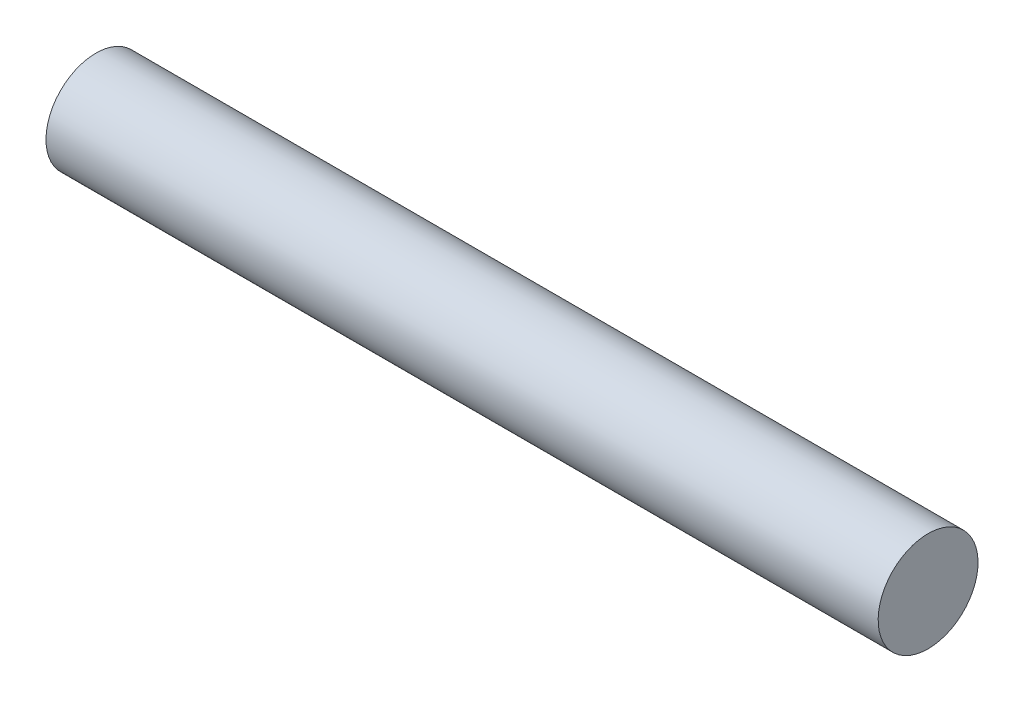
ISO-10303-21;
HEADER;
FILE_DESCRIPTION(('STEP AP214'),'2;1');
FILE_NAME('part.step','',(''),(''),'','','');
FILE_SCHEMA(('AUTOMOTIVE_DESIGN { 1 0 10303 214 1 1 1 1 }'));
ENDSEC;
DATA;
#1=APPLICATION_CONTEXT('core data for automotive mechanical design processes');
#2=APPLICATION_PROTOCOL_DEFINITION('international standard','automotive_design',2000,#1);
#3=PRODUCT_CONTEXT('',#1,'mechanical');
#4=PRODUCT('Part','Part','',(#3));
#5=PRODUCT_RELATED_PRODUCT_CATEGORY('part','',(#4));
#6=PRODUCT_DEFINITION_FORMATION('','',#4);
#7=PRODUCT_DEFINITION_CONTEXT('part definition',#1,'design');
#8=PRODUCT_DEFINITION('design','',#6,#7);
#9=PRODUCT_DEFINITION_SHAPE('','',#8);
#10=(LENGTH_UNIT() NAMED_UNIT(*) SI_UNIT(.MILLI.,.METRE.));
#11=(NAMED_UNIT(*) PLANE_ANGLE_UNIT() SI_UNIT($,.RADIAN.));
#12=(NAMED_UNIT(*) SI_UNIT($,.STERADIAN.) SOLID_ANGLE_UNIT());
#13=UNCERTAINTY_MEASURE_WITH_UNIT(LENGTH_MEASURE(1.E-05),#10,'distance_accuracy_value','');
#14=(GEOMETRIC_REPRESENTATION_CONTEXT(3) GLOBAL_UNCERTAINTY_ASSIGNED_CONTEXT((#13)) GLOBAL_UNIT_ASSIGNED_CONTEXT((#10,
#11,#12)) REPRESENTATION_CONTEXT('',''));
#15=CARTESIAN_POINT('',(0.,0.,0.));
#16=DIRECTION('',(0.,0.,1.));
#17=DIRECTION('',(1.,0.,0.));
#18=AXIS2_PLACEMENT_3D('',#15,#16,#17);
#19=CARTESIAN_POINT('',(-138.493816224319,8.44897959183673,0.));
#20=DIRECTION('',(-1.,0.,0.));
#21=DIRECTION('',(0.,-1.,0.));
#22=AXIS2_PLACEMENT_3D('',#19,#20,#21);
#23=PLANE('',#22);
#24=CARTESIAN_POINT('',(-138.493816224319,8.44897959183673,0.));
#25=DIRECTION('',(-1.,0.,0.));
#26=DIRECTION('',(0.,-1.,0.));
#27=AXIS2_PLACEMENT_3D('',#24,#25,#26);
#28=CIRCLE('',#27,12.);
#29=CARTESIAN_POINT('',(-138.493816224319,-3.55102040816327,0.));
#30=VERTEX_POINT('',#29);
#31=EDGE_CURVE('E10',#30,#30,#28,.T.);
#32=ORIENTED_EDGE('',*,*,#31,.T.);
#33=EDGE_LOOP('',(#32));
#34=FACE_BOUND('',#33,.T.);
#35=ADVANCED_FACE('F31',(#34),#23,.T.);
#36=CARTESIAN_POINT('',(-138.493816224319,8.44897959183673,0.));
#37=DIRECTION('',(-1.,0.,0.));
#38=DIRECTION('',(0.,-1.,0.));
#39=AXIS2_PLACEMENT_3D('',#36,#37,#38);
#40=CYLINDRICAL_SURFACE('',#39,12.);
#41=CARTESIAN_POINT('',(61.5061837756806,8.44897959183673,0.));
#42=DIRECTION('',(-1.,0.,0.));
#43=DIRECTION('',(0.,-1.,0.));
#44=AXIS2_PLACEMENT_3D('',#41,#42,#43);
#45=CIRCLE('',#44,12.);
#46=CARTESIAN_POINT('',(61.5061837756806,-3.55102040816327,0.));
#47=VERTEX_POINT('',#46);
#48=EDGE_CURVE('E37',#47,#47,#45,.T.);
#49=ORIENTED_EDGE('',*,*,#48,.T.);
#50=EDGE_LOOP('',(#49));
#51=FACE_BOUND('',#50,.T.);
#52=ORIENTED_EDGE('',*,*,#31,.F.);
#53=EDGE_LOOP('',(#52));
#54=FACE_BOUND('',#53,.T.);
#55=ADVANCED_FACE('F43',(#51,#54),#40,.T.);
#56=CARTESIAN_POINT('',(61.5061837756806,8.44897959183673,0.));
#57=DIRECTION('',(1.,0.,0.));
#58=DIRECTION('',(0.,1.,0.));
#59=AXIS2_PLACEMENT_3D('',#56,#57,#58);
#60=PLANE('',#59);
#61=ORIENTED_EDGE('',*,*,#48,.F.);
#62=EDGE_LOOP('',(#61));
#63=FACE_BOUND('',#62,.T.);
#64=ADVANCED_FACE('F46',(#63),#60,.T.);
#65=CLOSED_SHELL('',(#35,#55,#64));
#66=MANIFOLD_SOLID_BREP('B2',#65);
#67=ADVANCED_BREP_SHAPE_REPRESENTATION('',(#18,#66),#14);
#68=SHAPE_DEFINITION_REPRESENTATION(#9,#67);
ENDSEC;
END-ISO-10303-21;
